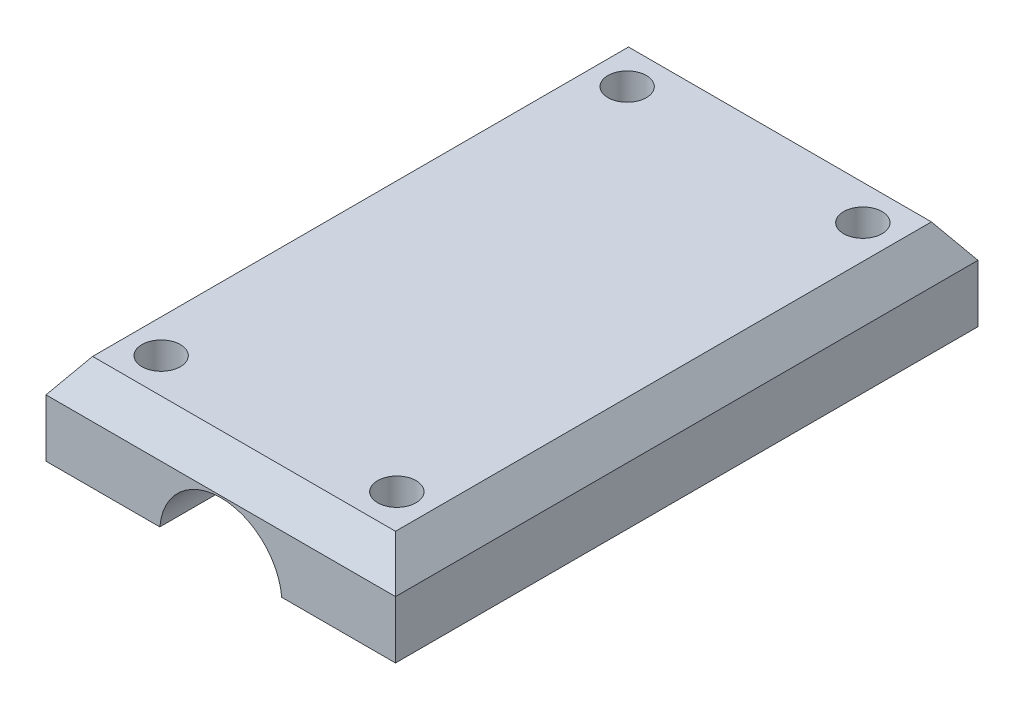
ISO-10303-21;
HEADER;
FILE_DESCRIPTION(('STEP AP214'),'2;1');
FILE_NAME('part.step','',(''),(''),'','','');
FILE_SCHEMA(('AUTOMOTIVE_DESIGN { 1 0 10303 214 1 1 1 1 }'));
ENDSEC;
DATA;
#1=APPLICATION_CONTEXT('core data for automotive mechanical design processes');
#2=APPLICATION_PROTOCOL_DEFINITION('international standard','automotive_design',2000,#1);
#3=PRODUCT_CONTEXT('',#1,'mechanical');
#4=PRODUCT('Part','Part','',(#3));
#5=PRODUCT_RELATED_PRODUCT_CATEGORY('part','',(#4));
#6=PRODUCT_DEFINITION_FORMATION('','',#4);
#7=PRODUCT_DEFINITION_CONTEXT('part definition',#1,'design');
#8=PRODUCT_DEFINITION('design','',#6,#7);
#9=PRODUCT_DEFINITION_SHAPE('','',#8);
#10=(LENGTH_UNIT() NAMED_UNIT(*) SI_UNIT(.MILLI.,.METRE.));
#11=(NAMED_UNIT(*) PLANE_ANGLE_UNIT() SI_UNIT($,.RADIAN.));
#12=(NAMED_UNIT(*) SI_UNIT($,.STERADIAN.) SOLID_ANGLE_UNIT());
#13=UNCERTAINTY_MEASURE_WITH_UNIT(LENGTH_MEASURE(1.E-05),#10,'distance_accuracy_value','');
#14=(GEOMETRIC_REPRESENTATION_CONTEXT(3) GLOBAL_UNCERTAINTY_ASSIGNED_CONTEXT((#13)) GLOBAL_UNIT_ASSIGNED_CONTEXT((#10,
#11,#12)) REPRESENTATION_CONTEXT('',''));
#15=CARTESIAN_POINT('',(0.,0.,0.));
#16=DIRECTION('',(0.,0.,1.));
#17=DIRECTION('',(1.,0.,0.));
#18=AXIS2_PLACEMENT_3D('',#15,#16,#17);
#19=CARTESIAN_POINT('',(0.,0.457567649425318,-50.));
#20=DIRECTION('',(0.,0.,-1.));
#21=DIRECTION('',(-1.,0.,0.));
#22=AXIS2_PLACEMENT_3D('',#19,#20,#21);
#23=PLANE('',#22);
#24=DIRECTION('',(0.,-1.,0.));
#25=VECTOR('',#24,1.);
#26=CARTESIAN_POINT('',(-15.,0.,-50.));
#27=LINE('',#26,#25);
#28=CARTESIAN_POINT('',(-15.,4.93613633709046,-50.));
#29=VERTEX_POINT('',#28);
#30=CARTESIAN_POINT('',(-15.,0.,-50.));
#31=VERTEX_POINT('',#30);
#32=EDGE_CURVE('E112',#29,#31,#27,.T.);
#33=ORIENTED_EDGE('',*,*,#32,.F.);
#34=DIRECTION('',(1.,0.,0.));
#35=VECTOR('',#34,1.);
#36=CARTESIAN_POINT('',(0.,4.93613633709046,-50.));
#37=LINE('',#36,#35);
#38=CARTESIAN_POINT('',(15.,4.93613633709046,-50.));
#39=VERTEX_POINT('',#38);
#40=EDGE_CURVE('E51',#29,#39,#37,.T.);
#41=ORIENTED_EDGE('',*,*,#40,.T.);
#42=DIRECTION('',(0.,1.,0.));
#43=VECTOR('',#42,1.);
#44=CARTESIAN_POINT('',(15.,7.79243235057468,-50.));
#45=LINE('',#44,#43);
#46=CARTESIAN_POINT('',(15.,0.,-50.));
#47=VERTEX_POINT('',#46);
#48=EDGE_CURVE('E105',#47,#39,#45,.T.);
#49=ORIENTED_EDGE('',*,*,#48,.F.);
#50=DIRECTION('',(1.,0.,0.));
#51=VECTOR('',#50,1.);
#52=CARTESIAN_POINT('',(5.23002216498168,0.,-50.));
#53=LINE('',#52,#51);
#54=CARTESIAN_POINT('',(5.23002216498168,0.,-50.));
#55=VERTEX_POINT('',#54);
#56=EDGE_CURVE('E108',#55,#47,#53,.T.);
#57=ORIENTED_EDGE('',*,*,#56,.F.);
#58=CARTESIAN_POINT('',(0.,-0.457567649425318,-50.));
#59=DIRECTION('',(0.,0.,-1.));
#60=DIRECTION('',(-1.,0.,0.));
#61=AXIS2_PLACEMENT_3D('',#58,#59,#60);
#62=CIRCLE('',#61,5.25);
#63=CARTESIAN_POINT('',(-5.23002216498163,0.,-50.));
#64=VERTEX_POINT('',#63);
#65=EDGE_CURVE('E135',#64,#55,#62,.T.);
#66=ORIENTED_EDGE('',*,*,#65,.F.);
#67=DIRECTION('',(1.,0.,0.));
#68=VECTOR('',#67,1.);
#69=CARTESIAN_POINT('',(-5.23002216498163,0.,-50.));
#70=LINE('',#69,#68);
#71=EDGE_CURVE('E138',#31,#64,#70,.T.);
#72=ORIENTED_EDGE('',*,*,#71,.F.);
#73=EDGE_LOOP('',(#33,#41,#49,#57,#66,#72));
#74=FACE_BOUND('',#73,.T.);
#75=ADVANCED_FACE('F41',(#74),#23,.T.);
#76=CARTESIAN_POINT('',(0.,-0.457567649425318,0.));
#77=DIRECTION('',(0.,0.,-1.));
#78=DIRECTION('',(-1.,0.,0.));
#79=AXIS2_PLACEMENT_3D('',#76,#77,#78);
#80=PLANE('',#79);
#81=DIRECTION('',(0.,1.,0.));
#82=VECTOR('',#81,1.);
#83=CARTESIAN_POINT('',(15.,7.79243235057468,0.));
#84=LINE('',#83,#82);
#85=CARTESIAN_POINT('',(15.,0.,0.));
#86=VERTEX_POINT('',#85);
#87=CARTESIAN_POINT('',(15.,4.93613633709046,0.));
#88=VERTEX_POINT('',#87);
#89=EDGE_CURVE('E118',#86,#88,#84,.T.);
#90=ORIENTED_EDGE('',*,*,#89,.T.);
#91=DIRECTION('',(-1.,0.,0.));
#92=VECTOR('',#91,1.);
#93=CARTESIAN_POINT('',(-15.,4.93613633709046,0.));
#94=LINE('',#93,#92);
#95=CARTESIAN_POINT('',(-15.,4.93613633709046,0.));
#96=VERTEX_POINT('',#95);
#97=EDGE_CURVE('E147',#88,#96,#94,.T.);
#98=ORIENTED_EDGE('',*,*,#97,.T.);
#99=DIRECTION('',(0.,-1.,0.));
#100=VECTOR('',#99,1.);
#101=CARTESIAN_POINT('',(-15.,0.,0.));
#102=LINE('',#101,#100);
#103=CARTESIAN_POINT('',(-15.,0.,0.));
#104=VERTEX_POINT('',#103);
#105=EDGE_CURVE('E129',#96,#104,#102,.T.);
#106=ORIENTED_EDGE('',*,*,#105,.T.);
#107=DIRECTION('',(1.,0.,0.));
#108=VECTOR('',#107,1.);
#109=CARTESIAN_POINT('',(-5.23002216498163,0.,0.));
#110=LINE('',#109,#108);
#111=CARTESIAN_POINT('',(-5.23002216498163,0.,0.));
#112=VERTEX_POINT('',#111);
#113=EDGE_CURVE('E126',#104,#112,#110,.T.);
#114=ORIENTED_EDGE('',*,*,#113,.T.);
#115=CARTESIAN_POINT('',(0.,-0.457567649425318,0.));
#116=DIRECTION('',(0.,0.,-1.));
#117=DIRECTION('',(-1.,0.,0.));
#118=AXIS2_PLACEMENT_3D('',#115,#116,#117);
#119=CIRCLE('',#118,5.25);
#120=CARTESIAN_POINT('',(5.23002216498168,0.,0.));
#121=VERTEX_POINT('',#120);
#122=EDGE_CURVE('E133',#112,#121,#119,.T.);
#123=ORIENTED_EDGE('',*,*,#122,.T.);
#124=DIRECTION('',(1.,0.,0.));
#125=VECTOR('',#124,1.);
#126=CARTESIAN_POINT('',(5.23002216498168,0.,0.));
#127=LINE('',#126,#125);
#128=EDGE_CURVE('E201',#121,#86,#127,.T.);
#129=ORIENTED_EDGE('',*,*,#128,.T.);
#130=EDGE_LOOP('',(#90,#98,#106,#114,#123,#129));
#131=FACE_BOUND('',#130,.T.);
#132=ADVANCED_FACE('F205',(#131),#80,.F.);
#133=CARTESIAN_POINT('',(5.23002216498168,0.,-80.9955158359767));
#134=DIRECTION('',(0.,-1.,0.));
#135=DIRECTION('',(0.,0.,-1.));
#136=AXIS2_PLACEMENT_3D('',#133,#134,#135);
#137=PLANE('',#136);
#138=CARTESIAN_POINT('',(10.1150110824909,0.,-45.));
#139=DIRECTION('',(0.,1.,0.));
#140=DIRECTION('',(0.,0.,1.));
#141=AXIS2_PLACEMENT_3D('',#138,#139,#140);
#142=CIRCLE('',#141,1.65);
#143=CARTESIAN_POINT('',(10.1150110824909,0.,-43.35));
#144=VERTEX_POINT('',#143);
#145=EDGE_CURVE('E180',#144,#144,#142,.T.);
#146=ORIENTED_EDGE('',*,*,#145,.T.);
#147=EDGE_LOOP('',(#146));
#148=FACE_BOUND('',#147,.T.);
#149=CARTESIAN_POINT('',(10.1150110824909,0.,-5.));
#150=DIRECTION('',(0.,1.,0.));
#151=DIRECTION('',(0.,0.,1.));
#152=AXIS2_PLACEMENT_3D('',#149,#150,#151);
#153=CIRCLE('',#152,1.65);
#154=CARTESIAN_POINT('',(10.1150110824909,0.,-3.35));
#155=VERTEX_POINT('',#154);
#156=EDGE_CURVE('E170',#155,#155,#153,.T.);
#157=ORIENTED_EDGE('',*,*,#156,.T.);
#158=EDGE_LOOP('',(#157));
#159=FACE_BOUND('',#158,.T.);
#160=DIRECTION('',(0.,0.,1.));
#161=VECTOR('',#160,1.);
#162=CARTESIAN_POINT('',(5.23002216498168,0.,-80.9955158359767));
#163=LINE('',#162,#161);
#164=EDGE_CURVE('E125',#55,#121,#163,.T.);
#165=ORIENTED_EDGE('',*,*,#164,.F.);
#166=ORIENTED_EDGE('',*,*,#56,.T.);
#167=DIRECTION('',(0.,0.,1.));
#168=VECTOR('',#167,1.);
#169=CARTESIAN_POINT('',(15.,0.,-80.9955158359767));
#170=LINE('',#169,#168);
#171=EDGE_CURVE('E113',#47,#86,#170,.T.);
#172=ORIENTED_EDGE('',*,*,#171,.T.);
#173=ORIENTED_EDGE('',*,*,#128,.F.);
#174=EDGE_LOOP('',(#165,#166,#172,#173));
#175=FACE_BOUND('',#174,.T.);
#176=ADVANCED_FACE('F124',(#148,#159,#175),#137,.T.);
#177=CARTESIAN_POINT('',(15.,7.79243235057468,-80.9955158359767));
#178=DIRECTION('',(1.,0.,0.));
#179=DIRECTION('',(0.,1.,0.));
#180=AXIS2_PLACEMENT_3D('',#177,#178,#179);
#181=PLANE('',#180);
#182=ORIENTED_EDGE('',*,*,#48,.T.);
#183=DIRECTION('',(0.,0.,1.));
#184=VECTOR('',#183,1.);
#185=CARTESIAN_POINT('',(15.,4.93613633709046,-80.9955158359767));
#186=LINE('',#185,#184);
#187=EDGE_CURVE('E11',#39,#88,#186,.T.);
#188=ORIENTED_EDGE('',*,*,#187,.T.);
#189=ORIENTED_EDGE('',*,*,#89,.F.);
#190=ORIENTED_EDGE('',*,*,#171,.F.);
#191=EDGE_LOOP('',(#182,#188,#189,#190));
#192=FACE_BOUND('',#191,.T.);
#193=ADVANCED_FACE('F116',(#192),#181,.T.);
#194=CARTESIAN_POINT('',(-15.,7.79243235057468,-80.9955158359767));
#195=DIRECTION('',(0.,1.,0.));
#196=DIRECTION('',(0.,0.,1.));
#197=AXIS2_PLACEMENT_3D('',#194,#195,#196);
#198=PLANE('',#197);
#199=DIRECTION('',(0.,0.,1.));
#200=VECTOR('',#199,1.);
#201=CARTESIAN_POINT('',(-13.,7.79243235057468,-80.9955158359767));
#202=LINE('',#201,#200);
#203=CARTESIAN_POINT('',(-13.,7.79243235057468,-48.));
#204=VERTEX_POINT('',#203);
#205=CARTESIAN_POINT('',(-13.,7.79243235057468,-2.));
#206=VERTEX_POINT('',#205);
#207=EDGE_CURVE('E154',#204,#206,#202,.T.);
#208=ORIENTED_EDGE('',*,*,#207,.T.);
#209=DIRECTION('',(1.,0.,0.));
#210=VECTOR('',#209,1.);
#211=CARTESIAN_POINT('',(15.,7.79243235057468,-2.));
#212=LINE('',#211,#210);
#213=CARTESIAN_POINT('',(13.,7.79243235057468,-2.));
#214=VERTEX_POINT('',#213);
#215=EDGE_CURVE('E156',#206,#214,#212,.T.);
#216=ORIENTED_EDGE('',*,*,#215,.T.);
#217=DIRECTION('',(0.,0.,-1.));
#218=VECTOR('',#217,1.);
#219=CARTESIAN_POINT('',(13.,7.79243235057468,-80.9955158359767));
#220=LINE('',#219,#218);
#221=CARTESIAN_POINT('',(13.,7.79243235057468,-48.));
#222=VERTEX_POINT('',#221);
#223=EDGE_CURVE('E150',#214,#222,#220,.T.);
#224=ORIENTED_EDGE('',*,*,#223,.T.);
#225=DIRECTION('',(-1.,0.,0.));
#226=VECTOR('',#225,1.);
#227=CARTESIAN_POINT('',(-15.,7.79243235057468,-48.));
#228=LINE('',#227,#226);
#229=EDGE_CURVE('E152',#222,#204,#228,.T.);
#230=ORIENTED_EDGE('',*,*,#229,.T.);
#231=EDGE_LOOP('',(#208,#216,#224,#230));
#232=FACE_BOUND('',#231,.T.);
#233=CARTESIAN_POINT('',(-10.1150110824908,7.79243235057468,-5.));
#234=DIRECTION('',(0.,1.,0.));
#235=DIRECTION('',(0.,0.,1.));
#236=AXIS2_PLACEMENT_3D('',#233,#234,#235);
#237=CIRCLE('',#236,1.65);
#238=CARTESIAN_POINT('',(-10.1150110824908,7.79243235057468,-3.35));
#239=VERTEX_POINT('',#238);
#240=EDGE_CURVE('E183',#239,#239,#237,.T.);
#241=ORIENTED_EDGE('',*,*,#240,.F.);
#242=EDGE_LOOP('',(#241));
#243=FACE_BOUND('',#242,.T.);
#244=CARTESIAN_POINT('',(10.1150110824909,7.79243235057468,-45.));
#245=DIRECTION('',(0.,1.,0.));
#246=DIRECTION('',(0.,0.,1.));
#247=AXIS2_PLACEMENT_3D('',#244,#245,#246);
#248=CIRCLE('',#247,1.65);
#249=CARTESIAN_POINT('',(10.1150110824909,7.79243235057468,-43.35));
#250=VERTEX_POINT('',#249);
#251=EDGE_CURVE('E190',#250,#250,#248,.T.);
#252=ORIENTED_EDGE('',*,*,#251,.F.);
#253=EDGE_LOOP('',(#252));
#254=FACE_BOUND('',#253,.T.);
#255=CARTESIAN_POINT('',(10.1150110824909,7.79243235057468,-5.));
#256=DIRECTION('',(0.,1.,0.));
#257=DIRECTION('',(0.,0.,1.));
#258=AXIS2_PLACEMENT_3D('',#255,#256,#257);
#259=CIRCLE('',#258,1.65);
#260=CARTESIAN_POINT('',(10.1150110824909,7.79243235057468,-3.35));
#261=VERTEX_POINT('',#260);
#262=EDGE_CURVE('E175',#261,#261,#259,.T.);
#263=ORIENTED_EDGE('',*,*,#262,.F.);
#264=EDGE_LOOP('',(#263));
#265=FACE_BOUND('',#264,.T.);
#266=CARTESIAN_POINT('',(-10.1150110824908,7.79243235057468,-45.));
#267=DIRECTION('',(0.,1.,0.));
#268=DIRECTION('',(0.,0.,1.));
#269=AXIS2_PLACEMENT_3D('',#266,#267,#268);
#270=CIRCLE('',#269,1.65);
#271=CARTESIAN_POINT('',(-10.1150110824908,7.79243235057468,-43.35));
#272=VERTEX_POINT('',#271);
#273=EDGE_CURVE('E186',#272,#272,#270,.T.);
#274=ORIENTED_EDGE('',*,*,#273,.F.);
#275=EDGE_LOOP('',(#274));
#276=FACE_BOUND('',#275,.T.);
#277=ADVANCED_FACE('F254',(#232,#243,#254,#265,#276),#198,.T.);
#278=CARTESIAN_POINT('',(-15.,0.,-80.9955158359767));
#279=DIRECTION('',(-1.,0.,0.));
#280=DIRECTION('',(0.,0.,1.));
#281=AXIS2_PLACEMENT_3D('',#278,#279,#280);
#282=PLANE('',#281);
#283=ORIENTED_EDGE('',*,*,#105,.F.);
#284=DIRECTION('',(0.,0.,-1.));
#285=VECTOR('',#284,1.);
#286=CARTESIAN_POINT('',(-15.,4.93613633709046,-80.9955158359767));
#287=LINE('',#286,#285);
#288=EDGE_CURVE('E66',#96,#29,#287,.T.);
#289=ORIENTED_EDGE('',*,*,#288,.T.);
#290=ORIENTED_EDGE('',*,*,#32,.T.);
#291=DIRECTION('',(0.,0.,1.));
#292=VECTOR('',#291,1.);
#293=CARTESIAN_POINT('',(-15.,0.,-80.9955158359767));
#294=LINE('',#293,#292);
#295=EDGE_CURVE('E141',#31,#104,#294,.T.);
#296=ORIENTED_EDGE('',*,*,#295,.T.);
#297=EDGE_LOOP('',(#283,#289,#290,#296));
#298=FACE_BOUND('',#297,.T.);
#299=ADVANCED_FACE('F214',(#298),#282,.T.);
#300=CARTESIAN_POINT('',(-5.23002216498163,0.,-80.9955158359767));
#301=DIRECTION('',(0.,-1.,0.));
#302=DIRECTION('',(1.,0.,0.));
#303=AXIS2_PLACEMENT_3D('',#300,#301,#302);
#304=PLANE('',#303);
#305=CARTESIAN_POINT('',(-10.1150110824908,0.,-5.));
#306=DIRECTION('',(0.,1.,0.));
#307=DIRECTION('',(0.,0.,1.));
#308=AXIS2_PLACEMENT_3D('',#305,#306,#307);
#309=CIRCLE('',#308,1.65);
#310=CARTESIAN_POINT('',(-10.1150110824908,0.,-3.35));
#311=VERTEX_POINT('',#310);
#312=EDGE_CURVE('E187',#311,#311,#309,.T.);
#313=ORIENTED_EDGE('',*,*,#312,.T.);
#314=EDGE_LOOP('',(#313));
#315=FACE_BOUND('',#314,.T.);
#316=CARTESIAN_POINT('',(-10.1150110824908,0.,-45.));
#317=DIRECTION('',(0.,1.,0.));
#318=DIRECTION('',(0.,0.,1.));
#319=AXIS2_PLACEMENT_3D('',#316,#317,#318);
#320=CIRCLE('',#319,1.65);
#321=CARTESIAN_POINT('',(-10.1150110824908,0.,-43.35));
#322=VERTEX_POINT('',#321);
#323=EDGE_CURVE('E195',#322,#322,#320,.T.);
#324=ORIENTED_EDGE('',*,*,#323,.T.);
#325=EDGE_LOOP('',(#324));
#326=FACE_BOUND('',#325,.T.);
#327=ORIENTED_EDGE('',*,*,#295,.F.);
#328=ORIENTED_EDGE('',*,*,#71,.T.);
#329=DIRECTION('',(0.,0.,1.));
#330=VECTOR('',#329,1.);
#331=CARTESIAN_POINT('',(-5.23002216498163,0.,-80.9955158359767));
#332=LINE('',#331,#330);
#333=EDGE_CURVE('E137',#64,#112,#332,.T.);
#334=ORIENTED_EDGE('',*,*,#333,.T.);
#335=ORIENTED_EDGE('',*,*,#113,.F.);
#336=EDGE_LOOP('',(#327,#328,#334,#335));
#337=FACE_BOUND('',#336,.T.);
#338=ADVANCED_FACE('F213',(#315,#326,#337),#304,.T.);
#339=CARTESIAN_POINT('',(0.,-0.457567649425318,-80.9955158359767));
#340=DIRECTION('',(0.,0.,1.));
#341=DIRECTION('',(1.,0.,0.));
#342=AXIS2_PLACEMENT_3D('',#339,#340,#341);
#343=CYLINDRICAL_SURFACE('',#342,5.25);
#344=ORIENTED_EDGE('',*,*,#333,.F.);
#345=ORIENTED_EDGE('',*,*,#65,.T.);
#346=ORIENTED_EDGE('',*,*,#164,.T.);
#347=ORIENTED_EDGE('',*,*,#122,.F.);
#348=EDGE_LOOP('',(#344,#345,#346,#347));
#349=FACE_BOUND('',#348,.T.);
#350=ADVANCED_FACE('F209',(#349),#343,.F.);
#351=CARTESIAN_POINT('',(-10.1150110824908,0.,-45.));
#352=DIRECTION('',(0.,1.,0.));
#353=DIRECTION('',(0.,0.,1.));
#354=AXIS2_PLACEMENT_3D('',#351,#352,#353);
#355=CYLINDRICAL_SURFACE('',#354,1.65);
#356=ORIENTED_EDGE('',*,*,#323,.F.);
#357=EDGE_LOOP('',(#356));
#358=FACE_BOUND('',#357,.T.);
#359=ORIENTED_EDGE('',*,*,#273,.T.);
#360=EDGE_LOOP('',(#359));
#361=FACE_BOUND('',#360,.T.);
#362=ADVANCED_FACE('F264',(#358,#361),#355,.F.);
#363=CARTESIAN_POINT('',(-10.1150110824908,0.,-5.));
#364=DIRECTION('',(0.,1.,0.));
#365=DIRECTION('',(0.,0.,1.));
#366=AXIS2_PLACEMENT_3D('',#363,#364,#365);
#367=CYLINDRICAL_SURFACE('',#366,1.65);
#368=ORIENTED_EDGE('',*,*,#312,.F.);
#369=EDGE_LOOP('',(#368));
#370=FACE_BOUND('',#369,.T.);
#371=ORIENTED_EDGE('',*,*,#240,.T.);
#372=EDGE_LOOP('',(#371));
#373=FACE_BOUND('',#372,.T.);
#374=ADVANCED_FACE('F268',(#370,#373),#367,.F.);
#375=CARTESIAN_POINT('',(10.1150110824909,0.,-5.));
#376=DIRECTION('',(0.,1.,0.));
#377=DIRECTION('',(0.,0.,1.));
#378=AXIS2_PLACEMENT_3D('',#375,#376,#377);
#379=CYLINDRICAL_SURFACE('',#378,1.65);
#380=ORIENTED_EDGE('',*,*,#156,.F.);
#381=EDGE_LOOP('',(#380));
#382=FACE_BOUND('',#381,.T.);
#383=ORIENTED_EDGE('',*,*,#262,.T.);
#384=EDGE_LOOP('',(#383));
#385=FACE_BOUND('',#384,.T.);
#386=ADVANCED_FACE('F272',(#382,#385),#379,.F.);
#387=CARTESIAN_POINT('',(10.1150110824909,0.,-45.));
#388=DIRECTION('',(0.,1.,0.));
#389=DIRECTION('',(0.,0.,1.));
#390=AXIS2_PLACEMENT_3D('',#387,#388,#389);
#391=CYLINDRICAL_SURFACE('',#390,1.65);
#392=ORIENTED_EDGE('',*,*,#145,.F.);
#393=EDGE_LOOP('',(#392));
#394=FACE_BOUND('',#393,.T.);
#395=ORIENTED_EDGE('',*,*,#251,.T.);
#396=EDGE_LOOP('',(#395));
#397=FACE_BOUND('',#396,.T.);
#398=ADVANCED_FACE('F270',(#394,#397),#391,.F.);
#399=CARTESIAN_POINT('',(-15.,7.79243235057468,-48.));
#400=DIRECTION('',(0.,-0.573576436351047,0.819152044288991));
#401=DIRECTION('',(-1.,0.,0.));
#402=AXIS2_PLACEMENT_3D('',#399,#400,#401);
#403=PLANE('',#402);
#404=DIRECTION('',(0.497542812164524,0.710564775461629,0.497542812164524));
#405=VECTOR('',#404,1.);
#406=CARTESIAN_POINT('',(-13.4950976998732,7.08535955735822,-48.4950976998732));
#407=LINE('',#406,#405);
#408=EDGE_CURVE('E164',#204,#29,#407,.F.);
#409=ORIENTED_EDGE('',*,*,#408,.F.);
#410=ORIENTED_EDGE('',*,*,#229,.F.);
#411=DIRECTION('',(-0.497542812164524,0.710564775461629,0.497542812164524));
#412=VECTOR('',#411,1.);
#413=CARTESIAN_POINT('',(22.6729042983872,-6.02190664257414,-57.6729042983872));
#414=LINE('',#413,#412);
#415=EDGE_CURVE('E46',#39,#222,#414,.T.);
#416=ORIENTED_EDGE('',*,*,#415,.F.);
#417=ORIENTED_EDGE('',*,*,#40,.F.);
#418=EDGE_LOOP('',(#409,#410,#416,#417));
#419=FACE_BOUND('',#418,.T.);
#420=ADVANCED_FACE('F44',(#419),#403,.F.);
#421=CARTESIAN_POINT('',(15.,4.93613633709046,-80.9955158359767));
#422=DIRECTION('',(-0.819152044288991,-0.573576436351047,0.));
#423=DIRECTION('',(0.,0.,1.));
#424=AXIS2_PLACEMENT_3D('',#421,#422,#423);
#425=PLANE('',#424);
#426=ORIENTED_EDGE('',*,*,#415,.T.);
#427=ORIENTED_EDGE('',*,*,#223,.F.);
#428=DIRECTION('',(-0.497542812164524,0.710564775461629,-0.497542812164524));
#429=VECTOR('',#428,1.);
#430=CARTESIAN_POINT('',(-5.05034679521629,33.5709991471667,-20.0503467952163));
#431=LINE('',#430,#429);
#432=EDGE_CURVE('E163',#88,#214,#431,.T.);
#433=ORIENTED_EDGE('',*,*,#432,.F.);
#434=ORIENTED_EDGE('',*,*,#187,.F.);
#435=EDGE_LOOP('',(#426,#427,#433,#434));
#436=FACE_BOUND('',#435,.T.);
#437=ADVANCED_FACE('F223',(#436),#425,.F.);
#438=CARTESIAN_POINT('',(-13.,7.79243235057468,-80.9955158359767));
#439=DIRECTION('',(0.819152044288991,-0.573576436351047,0.));
#440=DIRECTION('',(0.,0.,1.));
#441=AXIS2_PLACEMENT_3D('',#438,#439,#440);
#442=PLANE('',#441);
#443=ORIENTED_EDGE('',*,*,#408,.T.);
#444=ORIENTED_EDGE('',*,*,#288,.F.);
#445=DIRECTION('',(-0.497542812164524,-0.710564775461629,0.497542812164524));
#446=VECTOR('',#445,1.);
#447=CARTESIAN_POINT('',(6.55524909534314,35.7202223674344,-21.5552490953432));
#448=LINE('',#447,#446);
#449=EDGE_CURVE('E161',#206,#96,#448,.T.);
#450=ORIENTED_EDGE('',*,*,#449,.F.);
#451=ORIENTED_EDGE('',*,*,#207,.F.);
#452=EDGE_LOOP('',(#443,#444,#450,#451));
#453=FACE_BOUND('',#452,.T.);
#454=ADVANCED_FACE('F221',(#453),#442,.F.);
#455=CARTESIAN_POINT('',(0.,4.93613633709046,0.));
#456=DIRECTION('',(0.,0.573576436351047,0.819152044288991));
#457=DIRECTION('',(1.,0.,0.));
#458=AXIS2_PLACEMENT_3D('',#455,#456,#457);
#459=PLANE('',#458);
#460=ORIENTED_EDGE('',*,*,#432,.T.);
#461=ORIENTED_EDGE('',*,*,#215,.F.);
#462=ORIENTED_EDGE('',*,*,#449,.T.);
#463=ORIENTED_EDGE('',*,*,#97,.F.);
#464=EDGE_LOOP('',(#460,#461,#462,#463));
#465=FACE_BOUND('',#464,.T.);
#466=ADVANCED_FACE('F218',(#465),#459,.T.);
#467=CLOSED_SHELL('',(#75,#132,#176,#193,#277,#299,#338,#350,#362,#374,#386,#398,#420,#437,#454,#466));
#468=MANIFOLD_SOLID_BREP('B2',#467);
#469=ADVANCED_BREP_SHAPE_REPRESENTATION('',(#18,#468),#14);
#470=SHAPE_DEFINITION_REPRESENTATION(#9,#469);
ENDSEC;
END-ISO-10303-21;
